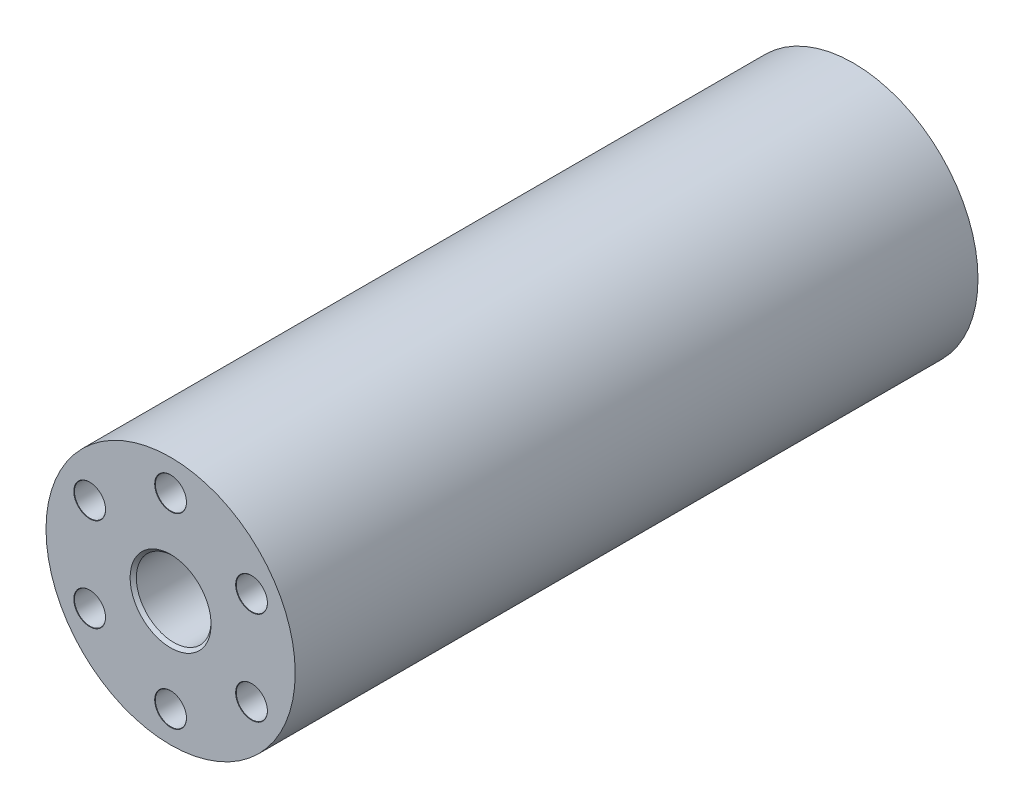
ISO-10303-21;
HEADER;
FILE_DESCRIPTION(('STEP AP214'),'2;1');
FILE_NAME('part.step','',(''),(''),'','','');
FILE_SCHEMA(('AUTOMOTIVE_DESIGN { 1 0 10303 214 1 1 1 1 }'));
ENDSEC;
DATA;
#1=APPLICATION_CONTEXT('core data for automotive mechanical design processes');
#2=APPLICATION_PROTOCOL_DEFINITION('international standard','automotive_design',2000,#1);
#3=PRODUCT_CONTEXT('',#1,'mechanical');
#4=PRODUCT('Part','Part','',(#3));
#5=PRODUCT_RELATED_PRODUCT_CATEGORY('part','',(#4));
#6=PRODUCT_DEFINITION_FORMATION('','',#4);
#7=PRODUCT_DEFINITION_CONTEXT('part definition',#1,'design');
#8=PRODUCT_DEFINITION('design','',#6,#7);
#9=PRODUCT_DEFINITION_SHAPE('','',#8);
#10=(LENGTH_UNIT() NAMED_UNIT(*) SI_UNIT(.MILLI.,.METRE.));
#11=(NAMED_UNIT(*) PLANE_ANGLE_UNIT() SI_UNIT($,.RADIAN.));
#12=(NAMED_UNIT(*) SI_UNIT($,.STERADIAN.) SOLID_ANGLE_UNIT());
#13=UNCERTAINTY_MEASURE_WITH_UNIT(LENGTH_MEASURE(1.E-05),#10,'distance_accuracy_value','');
#14=(GEOMETRIC_REPRESENTATION_CONTEXT(3) GLOBAL_UNCERTAINTY_ASSIGNED_CONTEXT((#13)) GLOBAL_UNIT_ASSIGNED_CONTEXT((#10,
#11,#12)) REPRESENTATION_CONTEXT('',''));
#15=CARTESIAN_POINT('',(0.,0.,0.));
#16=DIRECTION('',(0.,0.,1.));
#17=DIRECTION('',(1.,0.,0.));
#18=AXIS2_PLACEMENT_3D('',#15,#16,#17);
#19=CARTESIAN_POINT('',(0.,0.,54.8));
#20=DIRECTION('',(0.,0.,-1.));
#21=DIRECTION('',(-1.,0.,0.));
#22=AXIS2_PLACEMENT_3D('',#19,#20,#21);
#23=CYLINDRICAL_SURFACE('',#22,10.);
#24=CARTESIAN_POINT('',(0.,0.,54.8));
#25=DIRECTION('',(0.,0.,1.));
#26=DIRECTION('',(1.,0.,0.));
#27=AXIS2_PLACEMENT_3D('',#24,#25,#26);
#28=CIRCLE('',#27,10.);
#29=CARTESIAN_POINT('',(-10.,0.,54.8));
#30=VERTEX_POINT('',#29);
#31=EDGE_CURVE('E11',#30,#30,#28,.T.);
#32=CARTESIAN_POINT('',(0.,0.,0.));
#33=DIRECTION('',(0.,0.,1.));
#34=DIRECTION('',(1.,0.,0.));
#35=AXIS2_PLACEMENT_3D('',#32,#33,#34);
#36=CIRCLE('',#35,10.);
#37=CARTESIAN_POINT('',(-10.,0.,0.));
#38=VERTEX_POINT('',#37);
#39=EDGE_CURVE('E47',#38,#38,#36,.T.);
#40=CARTESIAN_POINT('',(-10.,0.,54.8));
#41=CARTESIAN_POINT('',(-10.,0.,54.2291666666667));
#42=CARTESIAN_POINT('',(-10.,0.,53.6583333333333));
#43=CARTESIAN_POINT('',(-10.,0.,52.5166666666667));
#44=CARTESIAN_POINT('',(-10.,0.,51.9458333333333));
#45=CARTESIAN_POINT('',(-10.,0.,50.8041666666667));
#46=CARTESIAN_POINT('',(-10.,0.,50.2333333333333));
#47=CARTESIAN_POINT('',(-10.,0.,49.0916666666667));
#48=CARTESIAN_POINT('',(-10.,0.,48.5208333333333));
#49=CARTESIAN_POINT('',(-10.,0.,47.3791666666667));
#50=CARTESIAN_POINT('',(-10.,0.,46.8083333333333));
#51=CARTESIAN_POINT('',(-10.,0.,45.6666666666667));
#52=CARTESIAN_POINT('',(-10.,0.,45.0958333333333));
#53=CARTESIAN_POINT('',(-10.,0.,43.9541666666667));
#54=CARTESIAN_POINT('',(-10.,0.,43.3833333333333));
#55=CARTESIAN_POINT('',(-10.,0.,42.2416666666667));
#56=CARTESIAN_POINT('',(-10.,0.,41.6708333333333));
#57=CARTESIAN_POINT('',(-10.,0.,40.5291666666667));
#58=CARTESIAN_POINT('',(-10.,0.,39.9583333333333));
#59=CARTESIAN_POINT('',(-10.,0.,38.8166666666667));
#60=CARTESIAN_POINT('',(-10.,0.,38.2458333333333));
#61=CARTESIAN_POINT('',(-10.,0.,37.1041666666667));
#62=CARTESIAN_POINT('',(-10.,0.,36.5333333333333));
#63=CARTESIAN_POINT('',(-10.,0.,35.3916666666667));
#64=CARTESIAN_POINT('',(-10.,0.,34.8208333333333));
#65=CARTESIAN_POINT('',(-10.,0.,33.6791666666667));
#66=CARTESIAN_POINT('',(-10.,0.,33.1083333333333));
#67=CARTESIAN_POINT('',(-10.,0.,31.9666666666667));
#68=CARTESIAN_POINT('',(-10.,0.,31.3958333333333));
#69=CARTESIAN_POINT('',(-10.,0.,30.2541666666667));
#70=CARTESIAN_POINT('',(-10.,0.,29.6833333333333));
#71=CARTESIAN_POINT('',(-10.,0.,28.5416666666667));
#72=CARTESIAN_POINT('',(-10.,0.,27.9708333333333));
#73=CARTESIAN_POINT('',(-10.,0.,26.8291666666667));
#74=CARTESIAN_POINT('',(-10.,0.,26.2583333333333));
#75=CARTESIAN_POINT('',(-10.,0.,25.1166666666667));
#76=CARTESIAN_POINT('',(-10.,0.,24.5458333333333));
#77=CARTESIAN_POINT('',(-10.,0.,23.4041666666667));
#78=CARTESIAN_POINT('',(-10.,0.,22.8333333333333));
#79=CARTESIAN_POINT('',(-10.,0.,21.6916666666667));
#80=CARTESIAN_POINT('',(-10.,0.,21.1208333333333));
#81=CARTESIAN_POINT('',(-10.,0.,19.9791666666667));
#82=CARTESIAN_POINT('',(-10.,0.,19.4083333333333));
#83=CARTESIAN_POINT('',(-10.,0.,18.2666666666667));
#84=CARTESIAN_POINT('',(-10.,0.,17.6958333333333));
#85=CARTESIAN_POINT('',(-10.,0.,16.5541666666667));
#86=CARTESIAN_POINT('',(-10.,0.,15.9833333333333));
#87=CARTESIAN_POINT('',(-10.,0.,14.8416666666667));
#88=CARTESIAN_POINT('',(-10.,0.,14.2708333333333));
#89=CARTESIAN_POINT('',(-10.,0.,13.1291666666667));
#90=CARTESIAN_POINT('',(-10.,0.,12.5583333333333));
#91=CARTESIAN_POINT('',(-10.,0.,11.4166666666667));
#92=CARTESIAN_POINT('',(-10.,0.,10.8458333333333));
#93=CARTESIAN_POINT('',(-10.,0.,9.70416666666667));
#94=CARTESIAN_POINT('',(-10.,0.,9.13333333333333));
#95=CARTESIAN_POINT('',(-10.,0.,7.99166666666667));
#96=CARTESIAN_POINT('',(-10.,0.,7.42083333333334));
#97=CARTESIAN_POINT('',(-10.,0.,6.27916666666667));
#98=CARTESIAN_POINT('',(-10.,0.,5.70833333333333));
#99=CARTESIAN_POINT('',(-10.,0.,4.56666666666666));
#100=CARTESIAN_POINT('',(-10.,0.,3.99583333333333));
#101=CARTESIAN_POINT('',(-10.,0.,2.85416666666666));
#102=CARTESIAN_POINT('',(-10.,0.,2.28333333333333));
#103=CARTESIAN_POINT('',(-10.,0.,1.14166666666667));
#104=CARTESIAN_POINT('',(-10.,0.,0.570833333333333));
#105=CARTESIAN_POINT('',(-10.,0.,0.));
#106=B_SPLINE_CURVE_WITH_KNOTS('',3,(#40,#41,#42,#43,#44,#45,#46,#47,#48,#49,#50,#51,#52,#53,
#54,#55,#56,#57,#58,#59,#60,#61,#62,#63,#64,#65,#66,#67,#68,#69,#70,#71,#72,#73,#74,#75,#76,#77,
#78,#79,#80,#81,#82,#83,#84,#85,#86,#87,#88,#89,#90,#91,#92,#93,#94,#95,#96,#97,#98,#99,#100,
#101,#102,#103,#104,#105),.UNSPECIFIED.,.F.,.F.,(4,2,2,2,2,2,2,2,2,2,2,2,2,2,2,2,2,2,2,2,2,2,2,
2,2,2,2,2,2,2,2,2,4),(0.,1.7125,3.425,5.1375,6.85,8.56249999999999,10.275,11.9875,13.7,15.4125,
17.125,18.8375,20.55,22.2625,23.975,25.6875,27.4,29.1125,30.825,32.5375,34.25,35.9625,37.675,
39.3875,41.1,42.8125,44.525,46.2375,47.95,49.6625,51.375,53.0875,54.8),.UNSPECIFIED.);
#107=EDGE_CURVE('BSEAM44',#30,#38,#106,.T.);
#108=ORIENTED_EDGE('',*,*,#31,.F.);
#109=ORIENTED_EDGE('',*,*,#39,.T.);
#110=ORIENTED_EDGE('',*,*,#107,.T.);
#111=ORIENTED_EDGE('',*,*,#107,.F.);
#112=EDGE_LOOP('',(#108,#110,#109,#111));
#113=FACE_BOUND('',#112,.T.);
#114=ADVANCED_FACE('F44',(#113),#23,.T.);
#115=CARTESIAN_POINT('',(0.,0.,54.8));
#116=DIRECTION('',(0.,0.,1.));
#117=DIRECTION('',(1.,0.,0.));
#118=AXIS2_PLACEMENT_3D('',#115,#116,#117);
#119=PLANE('',#118);
#120=CARTESIAN_POINT('',(0.,7.5,54.8));
#121=DIRECTION('',(0.,0.,1.));
#122=DIRECTION('',(1.,0.,0.));
#123=AXIS2_PLACEMENT_3D('',#120,#121,#122);
#124=CIRCLE('',#123,1.275);
#125=CARTESIAN_POINT('',(1.275,7.5,54.8));
#126=VERTEX_POINT('',#125);
#127=EDGE_CURVE('E100',#126,#126,#124,.T.);
#128=ORIENTED_EDGE('',*,*,#127,.F.);
#129=EDGE_LOOP('',(#128));
#130=FACE_BOUND('',#129,.T.);
#131=CARTESIAN_POINT('',(6.49519052838343,3.75000000000024,54.8));
#132=DIRECTION('',(0.,0.,1.));
#133=DIRECTION('',(1.,0.,0.));
#134=AXIS2_PLACEMENT_3D('',#131,#132,#133);
#135=CIRCLE('',#134,1.275);
#136=CARTESIAN_POINT('',(7.77019052838343,3.75000000000024,54.8));
#137=VERTEX_POINT('',#136);
#138=EDGE_CURVE('E91',#137,#137,#135,.T.);
#139=ORIENTED_EDGE('',*,*,#138,.F.);
#140=EDGE_LOOP('',(#139));
#141=FACE_BOUND('',#140,.T.);
#142=CARTESIAN_POINT('',(6.4951905283837,-3.74999999999976,54.8));
#143=DIRECTION('',(0.,0.,1.));
#144=DIRECTION('',(1.,0.,0.));
#145=AXIS2_PLACEMENT_3D('',#142,#143,#144);
#146=CIRCLE('',#145,1.275);
#147=CARTESIAN_POINT('',(7.7701905283837,-3.74999999999976,54.8));
#148=VERTEX_POINT('',#147);
#149=EDGE_CURVE('E111',#148,#148,#146,.T.);
#150=ORIENTED_EDGE('',*,*,#149,.F.);
#151=EDGE_LOOP('',(#150));
#152=FACE_BOUND('',#151,.T.);
#153=CARTESIAN_POINT('',(5.51957737314455E-13,-7.5,54.8));
#154=DIRECTION('',(0.,0.,1.));
#155=DIRECTION('',(1.,0.,0.));
#156=AXIS2_PLACEMENT_3D('',#153,#154,#155);
#157=CIRCLE('',#156,1.275);
#158=CARTESIAN_POINT('',(1.27500000000055,-7.5,54.8));
#159=VERTEX_POINT('',#158);
#160=EDGE_CURVE('E123',#159,#159,#157,.T.);
#161=ORIENTED_EDGE('',*,*,#160,.F.);
#162=EDGE_LOOP('',(#161));
#163=FACE_BOUND('',#162,.T.);
#164=CARTESIAN_POINT('',(-6.49519052838288,-3.75000000000024,54.8));
#165=DIRECTION('',(0.,0.,1.));
#166=DIRECTION('',(1.,0.,0.));
#167=AXIS2_PLACEMENT_3D('',#164,#165,#166);
#168=CIRCLE('',#167,1.275);
#169=CARTESIAN_POINT('',(-5.22019052838287,-3.75000000000024,54.8));
#170=VERTEX_POINT('',#169);
#171=EDGE_CURVE('E135',#170,#170,#168,.T.);
#172=ORIENTED_EDGE('',*,*,#171,.F.);
#173=EDGE_LOOP('',(#172));
#174=FACE_BOUND('',#173,.T.);
#175=CARTESIAN_POINT('',(-6.49519052838315,3.74999999999976,54.8));
#176=DIRECTION('',(0.,0.,1.));
#177=DIRECTION('',(1.,0.,0.));
#178=AXIS2_PLACEMENT_3D('',#175,#176,#177);
#179=CIRCLE('',#178,1.275);
#180=CARTESIAN_POINT('',(-5.22019052838315,3.74999999999976,54.8));
#181=VERTEX_POINT('',#180);
#182=EDGE_CURVE('E147',#181,#181,#179,.T.);
#183=ORIENTED_EDGE('',*,*,#182,.F.);
#184=EDGE_LOOP('',(#183));
#185=FACE_BOUND('',#184,.T.);
#186=CARTESIAN_POINT('',(0.,0.,54.8));
#187=DIRECTION('',(0.,0.,-1.));
#188=DIRECTION('',(-1.,0.,0.));
#189=AXIS2_PLACEMENT_3D('',#186,#187,#188);
#190=CIRCLE('',#189,3.24999999999999);
#191=CARTESIAN_POINT('',(-3.24999999999999,0.,54.8));
#192=VERTEX_POINT('',#191);
#193=EDGE_CURVE('E195',#192,#192,#190,.T.);
#194=ORIENTED_EDGE('',*,*,#193,.T.);
#195=EDGE_LOOP('',(#194));
#196=FACE_BOUND('',#195,.T.);
#197=ORIENTED_EDGE('',*,*,#31,.T.);
#198=EDGE_LOOP('',(#197));
#199=FACE_BOUND('',#198,.T.);
#200=ADVANCED_FACE('F220',(#130,#141,#152,#163,#174,#185,#196,#199),#119,.T.);
#201=CARTESIAN_POINT('',(0.,0.,0.));
#202=DIRECTION('',(0.,0.,1.));
#203=DIRECTION('',(1.,0.,0.));
#204=AXIS2_PLACEMENT_3D('',#201,#202,#203);
#205=PLANE('',#204);
#206=CARTESIAN_POINT('',(0.,7.,0.));
#207=DIRECTION('',(0.,0.,-1.));
#208=DIRECTION('',(-1.,0.,0.));
#209=AXIS2_PLACEMENT_3D('',#206,#207,#208);
#210=CIRCLE('',#209,1.275);
#211=CARTESIAN_POINT('',(-1.275,7.,0.));
#212=VERTEX_POINT('',#211);
#213=EDGE_CURVE('E159',#212,#212,#210,.T.);
#214=ORIENTED_EDGE('',*,*,#213,.F.);
#215=EDGE_LOOP('',(#214));
#216=FACE_BOUND('',#215,.T.);
#217=CARTESIAN_POINT('',(-6.06217782649152,-3.49999999999974,0.));
#218=DIRECTION('',(0.,0.,-1.));
#219=DIRECTION('',(-1.,0.,0.));
#220=AXIS2_PLACEMENT_3D('',#217,#218,#219);
#221=CIRCLE('',#220,1.275);
#222=CARTESIAN_POINT('',(-7.33717782649152,-3.49999999999974,0.));
#223=VERTEX_POINT('',#222);
#224=EDGE_CURVE('E171',#223,#223,#221,.T.);
#225=ORIENTED_EDGE('',*,*,#224,.F.);
#226=EDGE_LOOP('',(#225));
#227=FACE_BOUND('',#226,.T.);
#228=CARTESIAN_POINT('',(6.06217782649063,-3.50000000000026,0.));
#229=DIRECTION('',(0.,0.,-1.));
#230=DIRECTION('',(-1.,0.,0.));
#231=AXIS2_PLACEMENT_3D('',#228,#229,#230);
#232=CIRCLE('',#231,1.275);
#233=CARTESIAN_POINT('',(4.78717782649063,-3.50000000000026,0.));
#234=VERTEX_POINT('',#233);
#235=EDGE_CURVE('E183',#234,#234,#232,.T.);
#236=ORIENTED_EDGE('',*,*,#235,.F.);
#237=EDGE_LOOP('',(#236));
#238=FACE_BOUND('',#237,.T.);
#239=CARTESIAN_POINT('',(0.,0.,0.));
#240=DIRECTION('',(0.,0.,-1.));
#241=DIRECTION('',(-1.,0.,0.));
#242=AXIS2_PLACEMENT_3D('',#239,#240,#241);
#243=CIRCLE('',#242,3.25);
#244=CARTESIAN_POINT('',(-3.25,0.,0.));
#245=VERTEX_POINT('',#244);
#246=EDGE_CURVE('E199',#245,#245,#243,.T.);
#247=ORIENTED_EDGE('',*,*,#246,.F.);
#248=EDGE_LOOP('',(#247));
#249=FACE_BOUND('',#248,.T.);
#250=ORIENTED_EDGE('',*,*,#39,.F.);
#251=EDGE_LOOP('',(#250));
#252=FACE_BOUND('',#251,.T.);
#253=ADVANCED_FACE('F217',(#216,#227,#238,#249,#252),#205,.F.);
#254=CARTESIAN_POINT('',(0.,0.,54.55));
#255=DIRECTION('',(0.,0.,1.));
#256=DIRECTION('',(1.,0.,0.));
#257=AXIS2_PLACEMENT_3D('',#254,#255,#256);
#258=CONICAL_SURFACE('',#257,2.99999999999999,0.785398163397447);
#259=ORIENTED_EDGE('',*,*,#193,.F.);
#260=EDGE_LOOP('',(#259));
#261=FACE_BOUND('',#260,.T.);
#262=CARTESIAN_POINT('',(0.,0.,54.55));
#263=DIRECTION('',(0.,0.,-1.));
#264=DIRECTION('',(-1.,0.,0.));
#265=AXIS2_PLACEMENT_3D('',#262,#263,#264);
#266=CIRCLE('',#265,2.99999999999999);
#267=CARTESIAN_POINT('',(-2.99999999999999,0.,54.55));
#268=VERTEX_POINT('',#267);
#269=EDGE_CURVE('E207',#268,#268,#266,.T.);
#270=ORIENTED_EDGE('',*,*,#269,.T.);
#271=EDGE_LOOP('',(#270));
#272=FACE_BOUND('',#271,.T.);
#273=ADVANCED_FACE('F219',(#261,#272),#258,.F.);
#274=CARTESIAN_POINT('',(0.,0.,0.));
#275=DIRECTION('',(0.,0.,-1.));
#276=DIRECTION('',(-1.,0.,0.));
#277=AXIS2_PLACEMENT_3D('',#274,#275,#276);
#278=CYLINDRICAL_SURFACE('',#277,2.99999999999999);
#279=ORIENTED_EDGE('',*,*,#269,.F.);
#280=EDGE_LOOP('',(#279));
#281=FACE_BOUND('',#280,.T.);
#282=CARTESIAN_POINT('',(0.,0.,0.25));
#283=DIRECTION('',(0.,0.,-1.));
#284=DIRECTION('',(-1.,0.,0.));
#285=AXIS2_PLACEMENT_3D('',#282,#283,#284);
#286=CIRCLE('',#285,3.);
#287=CARTESIAN_POINT('',(-3.,0.,0.25));
#288=VERTEX_POINT('',#287);
#289=EDGE_CURVE('E203',#288,#288,#286,.T.);
#290=ORIENTED_EDGE('',*,*,#289,.T.);
#291=EDGE_LOOP('',(#290));
#292=FACE_BOUND('',#291,.T.);
#293=ADVANCED_FACE('F227',(#281,#292),#278,.F.);
#294=CARTESIAN_POINT('',(0.,0.,0.));
#295=DIRECTION('',(0.,0.,-1.));
#296=DIRECTION('',(-1.,0.,0.));
#297=AXIS2_PLACEMENT_3D('',#294,#295,#296);
#298=CONICAL_SURFACE('',#297,3.25,0.785398163397444);
#299=ORIENTED_EDGE('',*,*,#289,.F.);
#300=EDGE_LOOP('',(#299));
#301=FACE_BOUND('',#300,.T.);
#302=ORIENTED_EDGE('',*,*,#246,.T.);
#303=EDGE_LOOP('',(#302));
#304=FACE_BOUND('',#303,.T.);
#305=ADVANCED_FACE('F253',(#301,#304),#298,.F.);
#306=CARTESIAN_POINT('',(6.06217782649063,-3.50000000000026,6.));
#307=DIRECTION('',(0.,0.,-1.));
#308=DIRECTION('',(-1.,0.,0.));
#309=AXIS2_PLACEMENT_3D('',#306,#307,#308);
#310=CONICAL_SURFACE('',#309,1.25,1.02974425867665);
#311=CARTESIAN_POINT('',(6.06217782649063,-3.50000000000026,6.75107577378445));
#312=VERTEX_POINT('',#311);
#313=VERTEX_LOOP('',#312);
#314=FACE_BOUND('',#313,.T.);
#315=CARTESIAN_POINT('',(6.06217782649063,-3.50000000000026,6.));
#316=DIRECTION('',(0.,0.,-1.));
#317=DIRECTION('',(-1.,0.,0.));
#318=AXIS2_PLACEMENT_3D('',#315,#316,#317);
#319=CIRCLE('',#318,1.25);
#320=CARTESIAN_POINT('',(4.81217782649063,-3.50000000000026,6.));
#321=VERTEX_POINT('',#320);
#322=EDGE_CURVE('E191',#321,#321,#319,.T.);
#323=ORIENTED_EDGE('',*,*,#322,.T.);
#324=EDGE_LOOP('',(#323));
#325=FACE_BOUND('',#324,.T.);
#326=ADVANCED_FACE('F261',(#314,#325),#310,.F.);
#327=CARTESIAN_POINT('',(6.06217782649063,-3.50000000000026,0.));
#328=DIRECTION('',(0.,0.,-1.));
#329=DIRECTION('',(-1.,0.,0.));
#330=AXIS2_PLACEMENT_3D('',#327,#328,#329);
#331=CYLINDRICAL_SURFACE('',#330,1.25);
#332=ORIENTED_EDGE('',*,*,#322,.F.);
#333=EDGE_LOOP('',(#332));
#334=FACE_BOUND('',#333,.T.);
#335=CARTESIAN_POINT('',(6.06217782649063,-3.50000000000026,0.0250000000000007));
#336=DIRECTION('',(0.,0.,-1.));
#337=DIRECTION('',(-1.,0.,0.));
#338=AXIS2_PLACEMENT_3D('',#335,#336,#337);
#339=CIRCLE('',#338,1.25);
#340=CARTESIAN_POINT('',(4.81217782649063,-3.50000000000026,0.0250000000000007));
#341=VERTEX_POINT('',#340);
#342=EDGE_CURVE('E187',#341,#341,#339,.T.);
#343=ORIENTED_EDGE('',*,*,#342,.T.);
#344=EDGE_LOOP('',(#343));
#345=FACE_BOUND('',#344,.T.);
#346=ADVANCED_FACE('F273',(#334,#345),#331,.F.);
#347=CARTESIAN_POINT('',(6.06217782649063,-3.50000000000026,0.));
#348=DIRECTION('',(0.,0.,-1.));
#349=DIRECTION('',(-1.,0.,0.));
#350=AXIS2_PLACEMENT_3D('',#347,#348,#349);
#351=CONICAL_SURFACE('',#350,1.275,0.785398163397466);
#352=ORIENTED_EDGE('',*,*,#342,.F.);
#353=EDGE_LOOP('',(#352));
#354=FACE_BOUND('',#353,.T.);
#355=ORIENTED_EDGE('',*,*,#235,.T.);
#356=EDGE_LOOP('',(#355));
#357=FACE_BOUND('',#356,.T.);
#358=ADVANCED_FACE('F282',(#354,#357),#351,.F.);
#359=CARTESIAN_POINT('',(-6.06217782649152,-3.49999999999974,6.));
#360=DIRECTION('',(0.,0.,-1.));
#361=DIRECTION('',(-1.,0.,0.));
#362=AXIS2_PLACEMENT_3D('',#359,#360,#361);
#363=CONICAL_SURFACE('',#362,1.25,1.02974425867665);
#364=CARTESIAN_POINT('',(-6.06217782649152,-3.49999999999974,6.75107577378445));
#365=VERTEX_POINT('',#364);
#366=VERTEX_LOOP('',#365);
#367=FACE_BOUND('',#366,.T.);
#368=CARTESIAN_POINT('',(-6.06217782649152,-3.49999999999974,6.));
#369=DIRECTION('',(0.,0.,-1.));
#370=DIRECTION('',(-1.,0.,0.));
#371=AXIS2_PLACEMENT_3D('',#368,#369,#370);
#372=CIRCLE('',#371,1.25);
#373=CARTESIAN_POINT('',(-7.31217782649151,-3.49999999999974,6.));
#374=VERTEX_POINT('',#373);
#375=EDGE_CURVE('E179',#374,#374,#372,.T.);
#376=ORIENTED_EDGE('',*,*,#375,.T.);
#377=EDGE_LOOP('',(#376));
#378=FACE_BOUND('',#377,.T.);
#379=ADVANCED_FACE('F292',(#367,#378),#363,.F.);
#380=CARTESIAN_POINT('',(-6.06217782649152,-3.49999999999974,0.));
#381=DIRECTION('',(0.,0.,-1.));
#382=DIRECTION('',(-1.,0.,0.));
#383=AXIS2_PLACEMENT_3D('',#380,#381,#382);
#384=CYLINDRICAL_SURFACE('',#383,1.25);
#385=ORIENTED_EDGE('',*,*,#375,.F.);
#386=EDGE_LOOP('',(#385));
#387=FACE_BOUND('',#386,.T.);
#388=CARTESIAN_POINT('',(-6.06217782649152,-3.49999999999974,0.0250000000000007));
#389=DIRECTION('',(0.,0.,-1.));
#390=DIRECTION('',(-1.,0.,0.));
#391=AXIS2_PLACEMENT_3D('',#388,#389,#390);
#392=CIRCLE('',#391,1.25);
#393=CARTESIAN_POINT('',(-7.31217782649152,-3.49999999999974,0.0250000000000007));
#394=VERTEX_POINT('',#393);
#395=EDGE_CURVE('E175',#394,#394,#392,.T.);
#396=ORIENTED_EDGE('',*,*,#395,.T.);
#397=EDGE_LOOP('',(#396));
#398=FACE_BOUND('',#397,.T.);
#399=ADVANCED_FACE('F302',(#387,#398),#384,.F.);
#400=CARTESIAN_POINT('',(-6.06217782649152,-3.49999999999974,0.));
#401=DIRECTION('',(0.,0.,-1.));
#402=DIRECTION('',(-1.,0.,0.));
#403=AXIS2_PLACEMENT_3D('',#400,#401,#402);
#404=CONICAL_SURFACE('',#403,1.275,0.785398163397466);
#405=ORIENTED_EDGE('',*,*,#395,.F.);
#406=EDGE_LOOP('',(#405));
#407=FACE_BOUND('',#406,.T.);
#408=ORIENTED_EDGE('',*,*,#224,.T.);
#409=EDGE_LOOP('',(#408));
#410=FACE_BOUND('',#409,.T.);
#411=ADVANCED_FACE('F311',(#407,#410),#404,.F.);
#412=CARTESIAN_POINT('',(0.,7.,6.));
#413=DIRECTION('',(0.,0.,-1.));
#414=DIRECTION('',(-1.,0.,0.));
#415=AXIS2_PLACEMENT_3D('',#412,#413,#414);
#416=CONICAL_SURFACE('',#415,1.25,1.02974425867665);
#417=CARTESIAN_POINT('',(0.,7.,6.75107577378445));
#418=VERTEX_POINT('',#417);
#419=VERTEX_LOOP('',#418);
#420=FACE_BOUND('',#419,.T.);
#421=CARTESIAN_POINT('',(0.,7.,6.));
#422=DIRECTION('',(0.,0.,-1.));
#423=DIRECTION('',(-1.,0.,0.));
#424=AXIS2_PLACEMENT_3D('',#421,#422,#423);
#425=CIRCLE('',#424,1.25);
#426=CARTESIAN_POINT('',(-1.25,7.,6.));
#427=VERTEX_POINT('',#426);
#428=EDGE_CURVE('E167',#427,#427,#425,.T.);
#429=ORIENTED_EDGE('',*,*,#428,.T.);
#430=EDGE_LOOP('',(#429));
#431=FACE_BOUND('',#430,.T.);
#432=ADVANCED_FACE('F321',(#420,#431),#416,.F.);
#433=CARTESIAN_POINT('',(0.,7.,0.));
#434=DIRECTION('',(0.,0.,-1.));
#435=DIRECTION('',(-1.,0.,0.));
#436=AXIS2_PLACEMENT_3D('',#433,#434,#435);
#437=CYLINDRICAL_SURFACE('',#436,1.25);
#438=ORIENTED_EDGE('',*,*,#428,.F.);
#439=EDGE_LOOP('',(#438));
#440=FACE_BOUND('',#439,.T.);
#441=CARTESIAN_POINT('',(0.,7.,0.0250000000000007));
#442=DIRECTION('',(0.,0.,-1.));
#443=DIRECTION('',(-1.,0.,0.));
#444=AXIS2_PLACEMENT_3D('',#441,#442,#443);
#445=CIRCLE('',#444,1.25);
#446=CARTESIAN_POINT('',(-1.25,7.,0.0250000000000007));
#447=VERTEX_POINT('',#446);
#448=EDGE_CURVE('E163',#447,#447,#445,.T.);
#449=ORIENTED_EDGE('',*,*,#448,.T.);
#450=EDGE_LOOP('',(#449));
#451=FACE_BOUND('',#450,.T.);
#452=ADVANCED_FACE('F331',(#440,#451),#437,.F.);
#453=CARTESIAN_POINT('',(0.,7.,0.));
#454=DIRECTION('',(0.,0.,-1.));
#455=DIRECTION('',(-1.,0.,0.));
#456=AXIS2_PLACEMENT_3D('',#453,#454,#455);
#457=CONICAL_SURFACE('',#456,1.275,0.785398163397461);
#458=ORIENTED_EDGE('',*,*,#448,.F.);
#459=EDGE_LOOP('',(#458));
#460=FACE_BOUND('',#459,.T.);
#461=ORIENTED_EDGE('',*,*,#213,.T.);
#462=EDGE_LOOP('',(#461));
#463=FACE_BOUND('',#462,.T.);
#464=ADVANCED_FACE('F341',(#460,#463),#457,.F.);
#465=CARTESIAN_POINT('',(-6.49519052838315,3.74999999999976,48.8));
#466=DIRECTION('',(0.,0.,1.));
#467=DIRECTION('',(1.,0.,0.));
#468=AXIS2_PLACEMENT_3D('',#465,#466,#467);
#469=CONICAL_SURFACE('',#468,1.25,1.02974425867665);
#470=CARTESIAN_POINT('',(-6.49519052838315,3.74999999999976,48.0489242262155));
#471=VERTEX_POINT('',#470);
#472=VERTEX_LOOP('',#471);
#473=FACE_BOUND('',#472,.T.);
#474=CARTESIAN_POINT('',(-6.49519052838315,3.74999999999976,48.8));
#475=DIRECTION('',(0.,0.,1.));
#476=DIRECTION('',(1.,0.,0.));
#477=AXIS2_PLACEMENT_3D('',#474,#475,#476);
#478=CIRCLE('',#477,1.25);
#479=CARTESIAN_POINT('',(-5.24519052838315,3.74999999999976,48.8));
#480=VERTEX_POINT('',#479);
#481=EDGE_CURVE('E155',#480,#480,#478,.T.);
#482=ORIENTED_EDGE('',*,*,#481,.T.);
#483=EDGE_LOOP('',(#482));
#484=FACE_BOUND('',#483,.T.);
#485=ADVANCED_FACE('F351',(#473,#484),#469,.F.);
#486=CARTESIAN_POINT('',(-6.49519052838315,3.74999999999976,54.8));
#487=DIRECTION('',(0.,0.,1.));
#488=DIRECTION('',(1.,0.,0.));
#489=AXIS2_PLACEMENT_3D('',#486,#487,#488);
#490=CYLINDRICAL_SURFACE('',#489,1.24999999999999);
#491=ORIENTED_EDGE('',*,*,#481,.F.);
#492=EDGE_LOOP('',(#491));
#493=FACE_BOUND('',#492,.T.);
#494=CARTESIAN_POINT('',(-6.49519052838315,3.74999999999976,54.775));
#495=DIRECTION('',(0.,0.,1.));
#496=DIRECTION('',(1.,0.,0.));
#497=AXIS2_PLACEMENT_3D('',#494,#495,#496);
#498=CIRCLE('',#497,1.24999999999999);
#499=CARTESIAN_POINT('',(-5.24519052838316,3.74999999999976,54.775));
#500=VERTEX_POINT('',#499);
#501=EDGE_CURVE('E151',#500,#500,#498,.T.);
#502=ORIENTED_EDGE('',*,*,#501,.T.);
#503=EDGE_LOOP('',(#502));
#504=FACE_BOUND('',#503,.T.);
#505=ADVANCED_FACE('F361',(#493,#504),#490,.F.);
#506=CARTESIAN_POINT('',(-6.49519052838315,3.74999999999976,54.8));
#507=DIRECTION('',(0.,0.,1.));
#508=DIRECTION('',(1.,0.,0.));
#509=AXIS2_PLACEMENT_3D('',#506,#507,#508);
#510=CONICAL_SURFACE('',#509,1.275,0.785398163398003);
#511=ORIENTED_EDGE('',*,*,#501,.F.);
#512=EDGE_LOOP('',(#511));
#513=FACE_BOUND('',#512,.T.);
#514=ORIENTED_EDGE('',*,*,#182,.T.);
#515=EDGE_LOOP('',(#514));
#516=FACE_BOUND('',#515,.T.);
#517=ADVANCED_FACE('F371',(#513,#516),#510,.F.);
#518=CARTESIAN_POINT('',(-6.49519052838288,-3.75000000000024,48.8));
#519=DIRECTION('',(0.,0.,1.));
#520=DIRECTION('',(1.,0.,0.));
#521=AXIS2_PLACEMENT_3D('',#518,#519,#520);
#522=CONICAL_SURFACE('',#521,1.25,1.02974425867665);
#523=CARTESIAN_POINT('',(-6.49519052838288,-3.75000000000024,48.0489242262155));
#524=VERTEX_POINT('',#523);
#525=VERTEX_LOOP('',#524);
#526=FACE_BOUND('',#525,.T.);
#527=CARTESIAN_POINT('',(-6.49519052838288,-3.75000000000024,48.8));
#528=DIRECTION('',(0.,0.,1.));
#529=DIRECTION('',(1.,0.,0.));
#530=AXIS2_PLACEMENT_3D('',#527,#528,#529);
#531=CIRCLE('',#530,1.25);
#532=CARTESIAN_POINT('',(-5.24519052838288,-3.75000000000024,48.8));
#533=VERTEX_POINT('',#532);
#534=EDGE_CURVE('E143',#533,#533,#531,.T.);
#535=ORIENTED_EDGE('',*,*,#534,.T.);
#536=EDGE_LOOP('',(#535));
#537=FACE_BOUND('',#536,.T.);
#538=ADVANCED_FACE('F381',(#526,#537),#522,.F.);
#539=CARTESIAN_POINT('',(-6.49519052838288,-3.75000000000024,54.8));
#540=DIRECTION('',(0.,0.,1.));
#541=DIRECTION('',(1.,0.,0.));
#542=AXIS2_PLACEMENT_3D('',#539,#540,#541);
#543=CYLINDRICAL_SURFACE('',#542,1.24999999999999);
#544=ORIENTED_EDGE('',*,*,#534,.F.);
#545=EDGE_LOOP('',(#544));
#546=FACE_BOUND('',#545,.T.);
#547=CARTESIAN_POINT('',(-6.49519052838288,-3.75000000000024,54.775));
#548=DIRECTION('',(0.,0.,1.));
#549=DIRECTION('',(1.,0.,0.));
#550=AXIS2_PLACEMENT_3D('',#547,#548,#549);
#551=CIRCLE('',#550,1.24999999999999);
#552=CARTESIAN_POINT('',(-5.24519052838289,-3.75000000000024,54.775));
#553=VERTEX_POINT('',#552);
#554=EDGE_CURVE('E139',#553,#553,#551,.T.);
#555=ORIENTED_EDGE('',*,*,#554,.T.);
#556=EDGE_LOOP('',(#555));
#557=FACE_BOUND('',#556,.T.);
#558=ADVANCED_FACE('F391',(#546,#557),#543,.F.);
#559=CARTESIAN_POINT('',(-6.49519052838288,-3.75000000000024,54.8));
#560=DIRECTION('',(0.,0.,1.));
#561=DIRECTION('',(1.,0.,0.));
#562=AXIS2_PLACEMENT_3D('',#559,#560,#561);
#563=CONICAL_SURFACE('',#562,1.275,0.785398163398003);
#564=ORIENTED_EDGE('',*,*,#554,.F.);
#565=EDGE_LOOP('',(#564));
#566=FACE_BOUND('',#565,.T.);
#567=ORIENTED_EDGE('',*,*,#171,.T.);
#568=EDGE_LOOP('',(#567));
#569=FACE_BOUND('',#568,.T.);
#570=ADVANCED_FACE('F401',(#566,#569),#563,.F.);
#571=CARTESIAN_POINT('',(5.51957737314455E-13,-7.5,48.8));
#572=DIRECTION('',(0.,0.,1.));
#573=DIRECTION('',(1.,0.,0.));
#574=AXIS2_PLACEMENT_3D('',#571,#572,#573);
#575=CONICAL_SURFACE('',#574,1.25,1.02974425867665);
#576=CARTESIAN_POINT('',(5.50304200647022E-13,-7.5,48.0489242262155));
#577=VERTEX_POINT('',#576);
#578=VERTEX_LOOP('',#577);
#579=FACE_BOUND('',#578,.T.);
#580=CARTESIAN_POINT('',(5.51957737314455E-13,-7.5,48.8));
#581=DIRECTION('',(0.,0.,1.));
#582=DIRECTION('',(1.,0.,0.));
#583=AXIS2_PLACEMENT_3D('',#580,#581,#582);
#584=CIRCLE('',#583,1.25);
#585=CARTESIAN_POINT('',(1.25000000000055,-7.5,48.8));
#586=VERTEX_POINT('',#585);
#587=EDGE_CURVE('E131',#586,#586,#584,.T.);
#588=ORIENTED_EDGE('',*,*,#587,.T.);
#589=EDGE_LOOP('',(#588));
#590=FACE_BOUND('',#589,.T.);
#591=ADVANCED_FACE('F411',(#579,#590),#575,.F.);
#592=CARTESIAN_POINT('',(5.51957737314455E-13,-7.5,54.8));
#593=DIRECTION('',(0.,0.,1.));
#594=DIRECTION('',(1.,0.,0.));
#595=AXIS2_PLACEMENT_3D('',#592,#593,#594);
#596=CYLINDRICAL_SURFACE('',#595,1.24999999999999);
#597=ORIENTED_EDGE('',*,*,#587,.F.);
#598=EDGE_LOOP('',(#597));
#599=FACE_BOUND('',#598,.T.);
#600=CARTESIAN_POINT('',(5.51957737314455E-13,-7.5,54.775));
#601=DIRECTION('',(0.,0.,1.));
#602=DIRECTION('',(1.,0.,0.));
#603=AXIS2_PLACEMENT_3D('',#600,#601,#602);
#604=CIRCLE('',#603,1.24999999999999);
#605=CARTESIAN_POINT('',(1.25000000000054,-7.5,54.775));
#606=VERTEX_POINT('',#605);
#607=EDGE_CURVE('E127',#606,#606,#604,.T.);
#608=ORIENTED_EDGE('',*,*,#607,.T.);
#609=EDGE_LOOP('',(#608));
#610=FACE_BOUND('',#609,.T.);
#611=ADVANCED_FACE('F421',(#599,#610),#596,.F.);
#612=CARTESIAN_POINT('',(5.51957737314455E-13,-7.5,54.8));
#613=DIRECTION('',(0.,0.,1.));
#614=DIRECTION('',(1.,0.,0.));
#615=AXIS2_PLACEMENT_3D('',#612,#613,#614);
#616=CONICAL_SURFACE('',#615,1.275,0.785398163398003);
#617=ORIENTED_EDGE('',*,*,#607,.F.);
#618=EDGE_LOOP('',(#617));
#619=FACE_BOUND('',#618,.T.);
#620=ORIENTED_EDGE('',*,*,#160,.T.);
#621=EDGE_LOOP('',(#620));
#622=FACE_BOUND('',#621,.T.);
#623=ADVANCED_FACE('F431',(#619,#622),#616,.F.);
#624=CARTESIAN_POINT('',(6.4951905283837,-3.74999999999976,48.8));
#625=DIRECTION('',(0.,0.,1.));
#626=DIRECTION('',(1.,0.,0.));
#627=AXIS2_PLACEMENT_3D('',#624,#625,#626);
#628=CONICAL_SURFACE('',#627,1.25,1.02974425867665);
#629=CARTESIAN_POINT('',(6.4951905283837,-3.74999999999976,48.0489242262155));
#630=VERTEX_POINT('',#629);
#631=VERTEX_LOOP('',#630);
#632=FACE_BOUND('',#631,.T.);
#633=CARTESIAN_POINT('',(6.4951905283837,-3.74999999999976,48.8));
#634=DIRECTION('',(0.,0.,1.));
#635=DIRECTION('',(1.,0.,0.));
#636=AXIS2_PLACEMENT_3D('',#633,#634,#635);
#637=CIRCLE('',#636,1.25);
#638=CARTESIAN_POINT('',(7.7451905283837,-3.74999999999976,48.8));
#639=VERTEX_POINT('',#638);
#640=EDGE_CURVE('E119',#639,#639,#637,.T.);
#641=ORIENTED_EDGE('',*,*,#640,.T.);
#642=EDGE_LOOP('',(#641));
#643=FACE_BOUND('',#642,.T.);
#644=ADVANCED_FACE('F441',(#632,#643),#628,.F.);
#645=CARTESIAN_POINT('',(6.4951905283837,-3.74999999999976,54.8));
#646=DIRECTION('',(0.,0.,1.));
#647=DIRECTION('',(1.,0.,0.));
#648=AXIS2_PLACEMENT_3D('',#645,#646,#647);
#649=CYLINDRICAL_SURFACE('',#648,1.24999999999999);
#650=ORIENTED_EDGE('',*,*,#640,.F.);
#651=EDGE_LOOP('',(#650));
#652=FACE_BOUND('',#651,.T.);
#653=CARTESIAN_POINT('',(6.4951905283837,-3.74999999999976,54.775));
#654=DIRECTION('',(0.,0.,1.));
#655=DIRECTION('',(1.,0.,0.));
#656=AXIS2_PLACEMENT_3D('',#653,#654,#655);
#657=CIRCLE('',#656,1.24999999999999);
#658=CARTESIAN_POINT('',(7.74519052838369,-3.74999999999976,54.775));
#659=VERTEX_POINT('',#658);
#660=EDGE_CURVE('E115',#659,#659,#657,.T.);
#661=ORIENTED_EDGE('',*,*,#660,.T.);
#662=EDGE_LOOP('',(#661));
#663=FACE_BOUND('',#662,.T.);
#664=ADVANCED_FACE('F451',(#652,#663),#649,.F.);
#665=CARTESIAN_POINT('',(6.4951905283837,-3.74999999999976,54.8));
#666=DIRECTION('',(0.,0.,1.));
#667=DIRECTION('',(1.,0.,0.));
#668=AXIS2_PLACEMENT_3D('',#665,#666,#667);
#669=CONICAL_SURFACE('',#668,1.275,0.785398163398003);
#670=ORIENTED_EDGE('',*,*,#660,.F.);
#671=EDGE_LOOP('',(#670));
#672=FACE_BOUND('',#671,.T.);
#673=ORIENTED_EDGE('',*,*,#149,.T.);
#674=EDGE_LOOP('',(#673));
#675=FACE_BOUND('',#674,.T.);
#676=ADVANCED_FACE('F461',(#672,#675),#669,.F.);
#677=CARTESIAN_POINT('',(6.49519052838343,3.75000000000024,48.8));
#678=DIRECTION('',(0.,0.,1.));
#679=DIRECTION('',(1.,0.,0.));
#680=AXIS2_PLACEMENT_3D('',#677,#678,#679);
#681=CONICAL_SURFACE('',#680,1.25,1.02974425867665);
#682=CARTESIAN_POINT('',(6.49519052838343,3.75000000000024,48.0489242262155));
#683=VERTEX_POINT('',#682);
#684=VERTEX_LOOP('',#683);
#685=FACE_BOUND('',#684,.T.);
#686=CARTESIAN_POINT('',(6.49519052838343,3.75000000000024,48.8));
#687=DIRECTION('',(0.,0.,1.));
#688=DIRECTION('',(1.,0.,0.));
#689=AXIS2_PLACEMENT_3D('',#686,#687,#688);
#690=CIRCLE('',#689,1.25);
#691=CARTESIAN_POINT('',(7.74519052838342,3.75000000000024,48.8));
#692=VERTEX_POINT('',#691);
#693=EDGE_CURVE('E107',#692,#692,#690,.T.);
#694=ORIENTED_EDGE('',*,*,#693,.T.);
#695=EDGE_LOOP('',(#694));
#696=FACE_BOUND('',#695,.T.);
#697=ADVANCED_FACE('F471',(#685,#696),#681,.F.);
#698=CARTESIAN_POINT('',(6.49519052838343,3.75000000000024,54.8));
#699=DIRECTION('',(0.,0.,1.));
#700=DIRECTION('',(1.,0.,0.));
#701=AXIS2_PLACEMENT_3D('',#698,#699,#700);
#702=CYLINDRICAL_SURFACE('',#701,1.24999999999999);
#703=ORIENTED_EDGE('',*,*,#693,.F.);
#704=EDGE_LOOP('',(#703));
#705=FACE_BOUND('',#704,.T.);
#706=CARTESIAN_POINT('',(6.49519052838343,3.75000000000024,54.775));
#707=DIRECTION('',(0.,0.,1.));
#708=DIRECTION('',(1.,0.,0.));
#709=AXIS2_PLACEMENT_3D('',#706,#707,#708);
#710=CIRCLE('',#709,1.24999999999999);
#711=CARTESIAN_POINT('',(7.74519052838342,3.75000000000024,54.775));
#712=VERTEX_POINT('',#711);
#713=EDGE_CURVE('E97',#712,#712,#710,.T.);
#714=ORIENTED_EDGE('',*,*,#713,.T.);
#715=EDGE_LOOP('',(#714));
#716=FACE_BOUND('',#715,.T.);
#717=ADVANCED_FACE('F481',(#705,#716),#702,.F.);
#718=CARTESIAN_POINT('',(6.49519052838343,3.75000000000024,54.8));
#719=DIRECTION('',(0.,0.,1.));
#720=DIRECTION('',(1.,0.,0.));
#721=AXIS2_PLACEMENT_3D('',#718,#719,#720);
#722=CONICAL_SURFACE('',#721,1.275,0.785398163398003);
#723=ORIENTED_EDGE('',*,*,#713,.F.);
#724=EDGE_LOOP('',(#723));
#725=FACE_BOUND('',#724,.T.);
#726=ORIENTED_EDGE('',*,*,#138,.T.);
#727=EDGE_LOOP('',(#726));
#728=FACE_BOUND('',#727,.T.);
#729=ADVANCED_FACE('F84',(#725,#728),#722,.F.);
#730=CARTESIAN_POINT('',(0.,7.5,48.8));
#731=DIRECTION('',(0.,0.,1.));
#732=DIRECTION('',(1.,0.,0.));
#733=AXIS2_PLACEMENT_3D('',#730,#731,#732);
#734=CONICAL_SURFACE('',#733,1.25,1.02974425867665);
#735=CARTESIAN_POINT('',(0.,7.5,48.0489242262155));
#736=VERTEX_POINT('',#735);
#737=VERTEX_LOOP('',#736);
#738=FACE_BOUND('',#737,.T.);
#739=CARTESIAN_POINT('',(0.,7.5,48.8));
#740=DIRECTION('',(0.,0.,1.));
#741=DIRECTION('',(1.,0.,0.));
#742=AXIS2_PLACEMENT_3D('',#739,#740,#741);
#743=CIRCLE('',#742,1.25);
#744=CARTESIAN_POINT('',(1.25,7.5,48.8));
#745=VERTEX_POINT('',#744);
#746=EDGE_CURVE('E88',#745,#745,#743,.T.);
#747=ORIENTED_EDGE('',*,*,#746,.T.);
#748=EDGE_LOOP('',(#747));
#749=FACE_BOUND('',#748,.T.);
#750=ADVANCED_FACE('F80',(#738,#749),#734,.F.);
#751=CARTESIAN_POINT('',(0.,7.5,54.8));
#752=DIRECTION('',(0.,0.,1.));
#753=DIRECTION('',(1.,0.,0.));
#754=AXIS2_PLACEMENT_3D('',#751,#752,#753);
#755=CYLINDRICAL_SURFACE('',#754,1.24999999999999);
#756=ORIENTED_EDGE('',*,*,#746,.F.);
#757=EDGE_LOOP('',(#756));
#758=FACE_BOUND('',#757,.T.);
#759=CARTESIAN_POINT('',(0.,7.5,54.775));
#760=DIRECTION('',(0.,0.,1.));
#761=DIRECTION('',(1.,0.,0.));
#762=AXIS2_PLACEMENT_3D('',#759,#760,#761);
#763=CIRCLE('',#762,1.24999999999999);
#764=CARTESIAN_POINT('',(1.24999999999999,7.5,54.775));
#765=VERTEX_POINT('',#764);
#766=EDGE_CURVE('E92',#765,#765,#763,.T.);
#767=ORIENTED_EDGE('',*,*,#766,.T.);
#768=EDGE_LOOP('',(#767));
#769=FACE_BOUND('',#768,.T.);
#770=ADVANCED_FACE('F83',(#758,#769),#755,.F.);
#771=CARTESIAN_POINT('',(0.,7.5,54.8));
#772=DIRECTION('',(0.,0.,1.));
#773=DIRECTION('',(1.,0.,0.));
#774=AXIS2_PLACEMENT_3D('',#771,#772,#773);
#775=CONICAL_SURFACE('',#774,1.275,0.785398163398003);
#776=ORIENTED_EDGE('',*,*,#766,.F.);
#777=EDGE_LOOP('',(#776));
#778=FACE_BOUND('',#777,.T.);
#779=ORIENTED_EDGE('',*,*,#127,.T.);
#780=EDGE_LOOP('',(#779));
#781=FACE_BOUND('',#780,.T.);
#782=ADVANCED_FACE('F515',(#778,#781),#775,.F.);
#783=CLOSED_SHELL('',(#114,#200,#253,#273,#293,#305,#326,#346,#358,#379,#399,#411,#432,#452,
#464,#485,#505,#517,#538,#558,#570,#591,#611,#623,#644,#664,#676,#697,#717,#729,#750,#770,#782));
#784=MANIFOLD_SOLID_BREP('B2',#783);
#785=ADVANCED_BREP_SHAPE_REPRESENTATION('',(#18,#784),#14);
#786=SHAPE_DEFINITION_REPRESENTATION(#9,#785);
ENDSEC;
END-ISO-10303-21;
